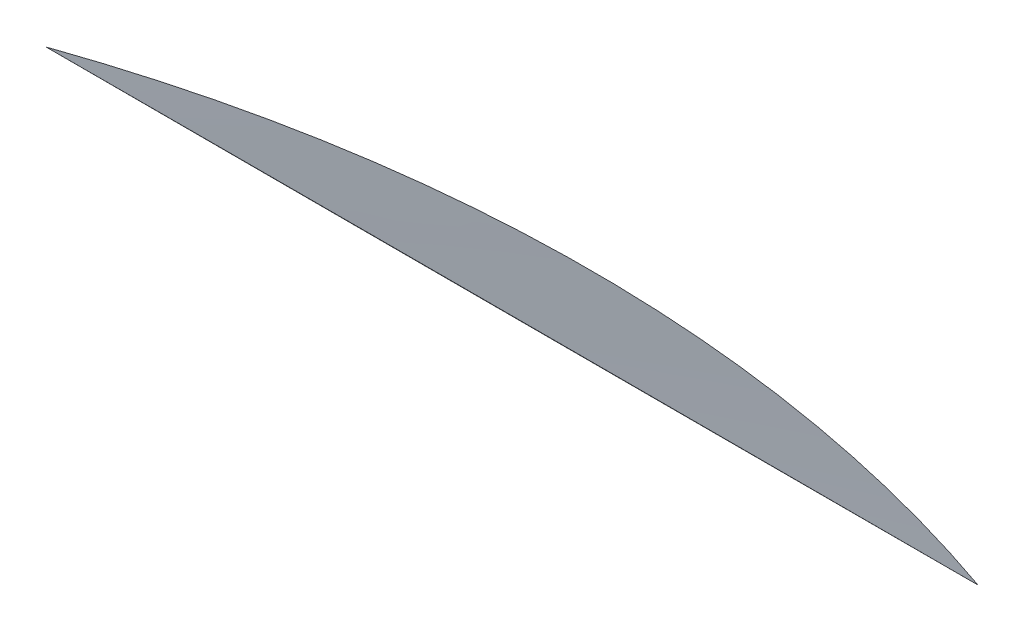
ISO-10303-21;
HEADER;
FILE_DESCRIPTION(('STEP AP214'),'2;1');
FILE_NAME('part.step','',(''),(''),'','','');
FILE_SCHEMA(('AUTOMOTIVE_DESIGN { 1 0 10303 214 1 1 1 1 }'));
ENDSEC;
DATA;
#1=APPLICATION_CONTEXT('core data for automotive mechanical design processes');
#2=APPLICATION_PROTOCOL_DEFINITION('international standard','automotive_design',2000,#1);
#3=PRODUCT_CONTEXT('',#1,'mechanical');
#4=PRODUCT('Part','Part','',(#3));
#5=PRODUCT_RELATED_PRODUCT_CATEGORY('part','',(#4));
#6=PRODUCT_DEFINITION_FORMATION('','',#4);
#7=PRODUCT_DEFINITION_CONTEXT('part definition',#1,'design');
#8=PRODUCT_DEFINITION('design','',#6,#7);
#9=PRODUCT_DEFINITION_SHAPE('','',#8);
#10=(LENGTH_UNIT() NAMED_UNIT(*) SI_UNIT(.MILLI.,.METRE.));
#11=(NAMED_UNIT(*) PLANE_ANGLE_UNIT() SI_UNIT($,.RADIAN.));
#12=(NAMED_UNIT(*) SI_UNIT($,.STERADIAN.) SOLID_ANGLE_UNIT());
#13=UNCERTAINTY_MEASURE_WITH_UNIT(LENGTH_MEASURE(1.E-05),#10,'distance_accuracy_value','');
#14=(GEOMETRIC_REPRESENTATION_CONTEXT(3) GLOBAL_UNCERTAINTY_ASSIGNED_CONTEXT((#13)) GLOBAL_UNIT_ASSIGNED_CONTEXT((#10,
#11,#12)) REPRESENTATION_CONTEXT('',''));
#15=CARTESIAN_POINT('',(0.,0.,0.));
#16=DIRECTION('',(0.,0.,1.));
#17=DIRECTION('',(1.,0.,0.));
#18=AXIS2_PLACEMENT_3D('',#15,#16,#17);
#19=CARTESIAN_POINT('',(-20.,-17.1993005,-24.));
#20=DIRECTION('',(0.,-1.,0.));
#21=DIRECTION('',(0.,0.,-1.));
#22=AXIS2_PLACEMENT_3D('',#19,#20,#21);
#23=CYLINDRICAL_SURFACE('',#22,0.625);
#24=CARTESIAN_POINT('',(-20.,-17.2000000000594,-24.));
#25=DIRECTION('',(0.,-1.,0.));
#26=DIRECTION('',(-1.,0.,0.));
#27=AXIS2_PLACEMENT_3D('',#24,#25,#26);
#28=CIRCLE('',#27,0.624999999995452);
#29=CARTESIAN_POINT('',(-19.7940184703037,-17.2000000000594,-24.5900818667098));
#30=VERTEX_POINT('',#29);
#31=CARTESIAN_POINT('',(-20.2059815296938,-17.2000000000291,-24.5900818667131));
#32=VERTEX_POINT('',#31);
#33=EDGE_CURVE('E30',#30,#32,#28,.F.);
#34=ORIENTED_EDGE('',*,*,#33,.F.);
#35=CARTESIAN_POINT('',(-20.,-16.6089571428479,-24.));
#36=DIRECTION('',(0.,-0.706531228854386,0.707681865426486));
#37=DIRECTION('',(0.,-0.707681865426486,-0.706531228854386));
#38=AXIS2_PLACEMENT_3D('',#35,#36,#37);
#39=ELLIPSE('',#38,0.884603502966761,0.625);
#40=EDGE_CURVE('E20',#32,#30,#39,.T.);
#41=ORIENTED_EDGE('',*,*,#40,.F.);
#42=EDGE_LOOP('',(#34,#41));
#43=FACE_BOUND('',#42,.T.);
#44=ADVANCED_FACE('F17',(#43),#23,.T.);
#45=CARTESIAN_POINT('',(-20.,-17.2000000001162,-24.));
#46=DIRECTION('',(0.,-1.,0.));
#47=DIRECTION('',(0.,0.,-1.));
#48=AXIS2_PLACEMENT_3D('',#45,#46,#47);
#49=CONICAL_SURFACE('',#48,0.625000000109139,1.02974425857086);
#50=ORIENTED_EDGE('',*,*,#33,.T.);
#51=CARTESIAN_POINT('',(-19.7940184702855,-17.200000000084,-24.5900818667723));
#52=CARTESIAN_POINT('',(-19.8175516126009,-17.1893398702166,-24.5794390694576));
#53=CARTESIAN_POINT('',(-19.8422927495385,-17.1791002548914,-24.5692161029624));
#54=CARTESIAN_POINT('',(-19.8942430000735,-17.1618844771133,-24.5520283167211));
#55=CARTESIAN_POINT('',(-19.9214801640555,-17.1549527565983,-24.5451078666536));
#56=CARTESIAN_POINT('',(-19.9652788822351,-17.1489194402578,-24.5390843600241));
#57=CARTESIAN_POINT('',(-19.9811857737301,-17.1477046716923,-24.5378715665793));
#58=CARTESIAN_POINT('',(-20.0128867681954,-17.1474457017551,-24.5376130177074));
#59=CARTESIAN_POINT('',(-20.028680617674,-17.1483823123539,-24.538548105449));
#60=CARTESIAN_POINT('',(-20.0634504050649,-17.1526175614193,-24.5427764683234));
#61=CARTESIAN_POINT('',(-20.0822974046589,-17.1564215884326,-24.5465743102798));
#62=CARTESIAN_POINT('',(-20.1190394641772,-17.1660781065954,-24.5562151276828));
#63=CARTESIAN_POINT('',(-20.1369238628064,-17.1719495893945,-24.5620770639002));
#64=CARTESIAN_POINT('',(-20.1632117924227,-17.1817784560676,-24.571889949588));
#65=CARTESIAN_POINT('',(-20.1719789428998,-17.1852697568651,-24.5753755737975));
#66=CARTESIAN_POINT('',(-20.189186743387,-17.1924761482708,-24.5825702481621));
#67=CARTESIAN_POINT('',(-20.1976300479934,-17.1961880531422,-24.5862761177602));
#68=CARTESIAN_POINT('',(-20.2059815297191,-17.2000000000801,-24.590081866764));
#69=B_SPLINE_CURVE_WITH_KNOTS('',3,(#51,#52,#53,#54,#55,#56,#57,#58,#59,#60,#61,#62,#63,#64,#65,
#66,#67,#68),.UNSPECIFIED.,.F.,.F.,(4,2,2,2,2,2,2,2,4),(0.,0.0849701388214027,0.17105178608087,
0.218753176247496,0.266030774241359,0.32446872793445,0.383458133065123,0.413631287093372,
0.443442607403452),.UNSPECIFIED.);
#70=EDGE_CURVE('E11',#30,#32,#69,.T.);
#71=ORIENTED_EDGE('',*,*,#70,.F.);
#72=EDGE_LOOP('',(#50,#71));
#73=FACE_BOUND('',#72,.T.);
#74=ADVANCED_FACE('F35',(#73),#49,.T.);
#75=CARTESIAN_POINT('',(-20.,-17.19091549138,-24.58101212878));
#76=DIRECTION('',(0.,-0.706531228854386,0.707681865426486));
#77=DIRECTION('',(0.,-0.707681865426486,-0.706531228854386));
#78=AXIS2_PLACEMENT_3D('',#75,#76,#77);
#79=PLANE('',#78);
#80=ORIENTED_EDGE('',*,*,#40,.T.);
#81=ORIENTED_EDGE('',*,*,#70,.T.);
#82=EDGE_LOOP('',(#80,#81));
#83=FACE_BOUND('',#82,.T.);
#84=ADVANCED_FACE('F37',(#83),#79,.T.);
#85=CLOSED_SHELL('',(#44,#74,#84));
#86=MANIFOLD_SOLID_BREP('B1',#85);
#87=ADVANCED_BREP_SHAPE_REPRESENTATION('',(#18,#86),#14);
#88=SHAPE_DEFINITION_REPRESENTATION(#9,#87);
ENDSEC;
END-ISO-10303-21;
